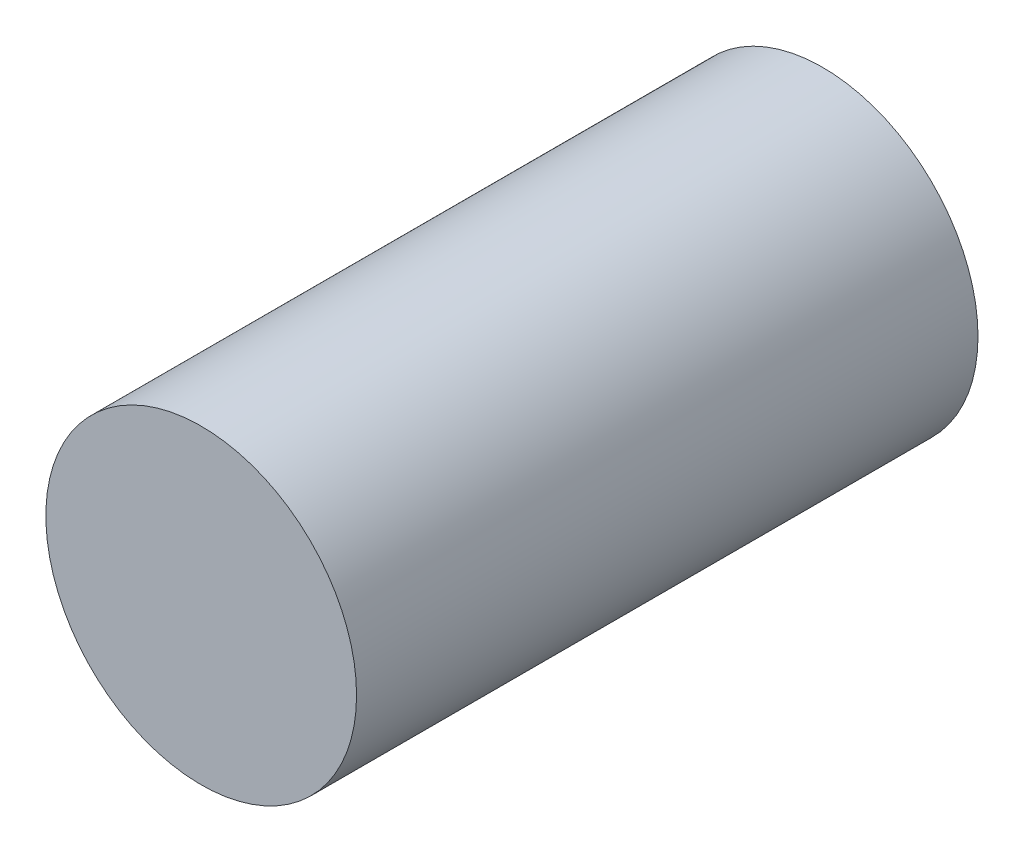
ISO-10303-21;
HEADER;
FILE_DESCRIPTION(('STEP AP214'),'2;1');
FILE_NAME('part.step','',(''),(''),'','','');
FILE_SCHEMA(('AUTOMOTIVE_DESIGN { 1 0 10303 214 1 1 1 1 }'));
ENDSEC;
DATA;
#1=APPLICATION_CONTEXT('core data for automotive mechanical design processes');
#2=APPLICATION_PROTOCOL_DEFINITION('international standard','automotive_design',2000,#1);
#3=PRODUCT_CONTEXT('',#1,'mechanical');
#4=PRODUCT('Part','Part','',(#3));
#5=PRODUCT_RELATED_PRODUCT_CATEGORY('part','',(#4));
#6=PRODUCT_DEFINITION_FORMATION('','',#4);
#7=PRODUCT_DEFINITION_CONTEXT('part definition',#1,'design');
#8=PRODUCT_DEFINITION('design','',#6,#7);
#9=PRODUCT_DEFINITION_SHAPE('','',#8);
#10=(LENGTH_UNIT() NAMED_UNIT(*) SI_UNIT(.MILLI.,.METRE.));
#11=(NAMED_UNIT(*) PLANE_ANGLE_UNIT() SI_UNIT($,.RADIAN.));
#12=(NAMED_UNIT(*) SI_UNIT($,.STERADIAN.) SOLID_ANGLE_UNIT());
#13=UNCERTAINTY_MEASURE_WITH_UNIT(LENGTH_MEASURE(1.E-05),#10,'distance_accuracy_value','');
#14=(GEOMETRIC_REPRESENTATION_CONTEXT(3) GLOBAL_UNCERTAINTY_ASSIGNED_CONTEXT((#13)) GLOBAL_UNIT_ASSIGNED_CONTEXT((#10,
#11,#12)) REPRESENTATION_CONTEXT('',''));
#15=CARTESIAN_POINT('',(0.,0.,0.));
#16=DIRECTION('',(0.,0.,1.));
#17=DIRECTION('',(1.,0.,0.));
#18=AXIS2_PLACEMENT_3D('',#15,#16,#17);
#19=CARTESIAN_POINT('',(0.,0.,200.));
#20=DIRECTION('',(0.,0.,-1.));
#21=DIRECTION('',(-1.,0.,0.));
#22=AXIS2_PLACEMENT_3D('',#19,#20,#21);
#23=CYLINDRICAL_SURFACE('',#22,50.);
#24=CARTESIAN_POINT('',(0.,0.,200.));
#25=DIRECTION('',(0.,0.,1.));
#26=DIRECTION('',(1.,0.,0.));
#27=AXIS2_PLACEMENT_3D('',#24,#25,#26);
#28=CIRCLE('',#27,50.);
#29=CARTESIAN_POINT('',(50.,0.,200.));
#30=VERTEX_POINT('',#29);
#31=EDGE_CURVE('E10',#30,#30,#28,.T.);
#32=ORIENTED_EDGE('',*,*,#31,.F.);
#33=EDGE_LOOP('',(#32));
#34=FACE_BOUND('',#33,.T.);
#35=CARTESIAN_POINT('',(0.,0.,0.));
#36=DIRECTION('',(0.,0.,1.));
#37=DIRECTION('',(1.,0.,0.));
#38=AXIS2_PLACEMENT_3D('',#35,#36,#37);
#39=CIRCLE('',#38,50.);
#40=CARTESIAN_POINT('',(50.,0.,0.));
#41=VERTEX_POINT('',#40);
#42=EDGE_CURVE('E33',#41,#41,#39,.T.);
#43=ORIENTED_EDGE('',*,*,#42,.T.);
#44=EDGE_LOOP('',(#43));
#45=FACE_BOUND('',#44,.T.);
#46=ADVANCED_FACE('F30',(#34,#45),#23,.T.);
#47=CARTESIAN_POINT('',(0.,0.,200.));
#48=DIRECTION('',(0.,0.,1.));
#49=DIRECTION('',(1.,0.,0.));
#50=AXIS2_PLACEMENT_3D('',#47,#48,#49);
#51=PLANE('',#50);
#52=ORIENTED_EDGE('',*,*,#31,.T.);
#53=EDGE_LOOP('',(#52));
#54=FACE_BOUND('',#53,.T.);
#55=ADVANCED_FACE('F45',(#54),#51,.T.);
#56=CARTESIAN_POINT('',(0.,0.,0.));
#57=DIRECTION('',(0.,0.,1.));
#58=DIRECTION('',(1.,0.,0.));
#59=AXIS2_PLACEMENT_3D('',#56,#57,#58);
#60=PLANE('',#59);
#61=ORIENTED_EDGE('',*,*,#42,.F.);
#62=EDGE_LOOP('',(#61));
#63=FACE_BOUND('',#62,.T.);
#64=ADVANCED_FACE('F43',(#63),#60,.F.);
#65=CLOSED_SHELL('',(#46,#55,#64));
#66=MANIFOLD_SOLID_BREP('B2',#65);
#67=ADVANCED_BREP_SHAPE_REPRESENTATION('',(#18,#66),#14);
#68=SHAPE_DEFINITION_REPRESENTATION(#9,#67);
ENDSEC;
END-ISO-10303-21;
